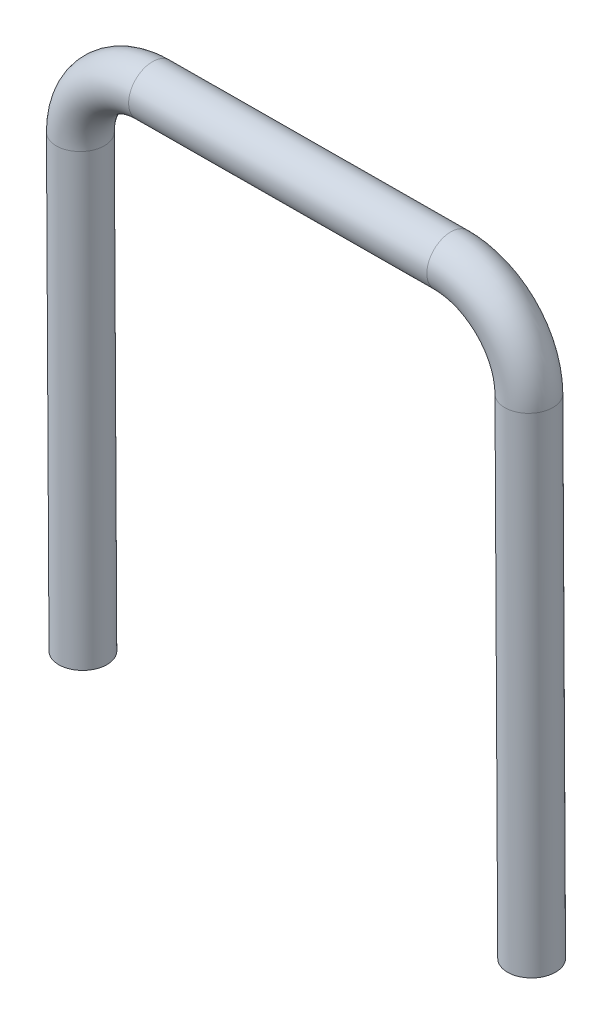
ISO-10303-21;
HEADER;
FILE_DESCRIPTION(('STEP AP214'),'2;1');
FILE_NAME('part.step','',(''),(''),'','','');
FILE_SCHEMA(('AUTOMOTIVE_DESIGN { 1 0 10303 214 1 1 1 1 }'));
ENDSEC;
DATA;
#1=APPLICATION_CONTEXT('core data for automotive mechanical design processes');
#2=APPLICATION_PROTOCOL_DEFINITION('international standard','automotive_design',2000,#1);
#3=PRODUCT_CONTEXT('',#1,'mechanical');
#4=PRODUCT('Part','Part','',(#3));
#5=PRODUCT_RELATED_PRODUCT_CATEGORY('part','',(#4));
#6=PRODUCT_DEFINITION_FORMATION('','',#4);
#7=PRODUCT_DEFINITION_CONTEXT('part definition',#1,'design');
#8=PRODUCT_DEFINITION('design','',#6,#7);
#9=PRODUCT_DEFINITION_SHAPE('','',#8);
#10=(LENGTH_UNIT() NAMED_UNIT(*) SI_UNIT(.MILLI.,.METRE.));
#11=(NAMED_UNIT(*) PLANE_ANGLE_UNIT() SI_UNIT($,.RADIAN.));
#12=(NAMED_UNIT(*) SI_UNIT($,.STERADIAN.) SOLID_ANGLE_UNIT());
#13=UNCERTAINTY_MEASURE_WITH_UNIT(LENGTH_MEASURE(1.E-05),#10,'distance_accuracy_value','');
#14=(GEOMETRIC_REPRESENTATION_CONTEXT(3) GLOBAL_UNCERTAINTY_ASSIGNED_CONTEXT((#13)) GLOBAL_UNIT_ASSIGNED_CONTEXT((#10,
#11,#12)) REPRESENTATION_CONTEXT('',''));
#15=CARTESIAN_POINT('',(0.,0.,0.));
#16=DIRECTION('',(0.,0.,1.));
#17=DIRECTION('',(1.,0.,0.));
#18=AXIS2_PLACEMENT_3D('',#15,#16,#17);
#19=CARTESIAN_POINT('',(-46.420753356991,4.59161939468769,-1.76544371842712E-13));
#20=DIRECTION('',(-0.00563734568943531,0.999984110040543,0.));
#21=DIRECTION('',(0.,0.,-1.));
#22=AXIS2_PLACEMENT_3D('',#19,#20,#21);
#23=CYLINDRICAL_SURFACE('',#22,2.5);
#24=CARTESIAN_POINT('',(-46.6839243014587,51.2743628683252,0.));
#25=DIRECTION('',(-0.00563734568943116,0.999984110040544,0.));
#26=DIRECTION('',(0.,0.,-1.));
#27=AXIS2_PLACEMENT_3D('',#24,#25,#26);
#28=CIRCLE('',#27,2.5);
#29=CARTESIAN_POINT('',(-46.6839243014588,51.2743628683252,-2.50000000000001));
#30=VERTEX_POINT('',#29);
#31=EDGE_CURVE('E12',#30,#30,#28,.T.);
#32=ORIENTED_EDGE('',*,*,#31,.F.);
#33=EDGE_LOOP('',(#32));
#34=FACE_BOUND('',#33,.T.);
#35=CARTESIAN_POINT('',(-46.420753356991,4.59161939468769,-1.76544371842712E-13));
#36=DIRECTION('',(0.00563734568943531,-0.999984110040544,0.));
#37=DIRECTION('',(0.,0.,1.));
#38=AXIS2_PLACEMENT_3D('',#35,#36,#37);
#39=CIRCLE('',#38,2.5);
#40=CARTESIAN_POINT('',(-46.420753356991,4.59161939468768,2.49999999999982));
#41=VERTEX_POINT('',#40);
#42=EDGE_CURVE('E137',#41,#41,#39,.T.);
#43=ORIENTED_EDGE('',*,*,#42,.F.);
#44=EDGE_LOOP('',(#43));
#45=FACE_BOUND('',#44,.T.);
#46=ADVANCED_FACE('F105',(#34,#45),#23,.T.);
#47=CARTESIAN_POINT('',(-8.04265016746616,50.9751657825808,0.));
#48=DIRECTION('',(0.,0.,1.));
#49=DIRECTION('',(0.999984110040544,0.00563734568942783,0.));
#50=AXIS2_PLACEMENT_3D('',#47,#48,#49);
#51=TOROIDAL_SURFACE('',#50,8.08507110906829,2.5);
#52=CARTESIAN_POINT('',(-8.08822850823162,59.0601084201969,0.));
#53=DIRECTION('',(-0.999984110040544,-0.00563734568943199,0.));
#54=DIRECTION('',(0.,0.,1.));
#55=AXIS2_PLACEMENT_3D('',#52,#53,#54);
#56=CIRCLE('',#55,2.5);
#57=CARTESIAN_POINT('',(-8.08822850823162,59.0601084201969,2.5));
#58=VERTEX_POINT('',#57);
#59=EDGE_CURVE('E120',#58,#58,#56,.T.);
#60=ORIENTED_EDGE('',*,*,#59,.F.);
#61=EDGE_LOOP('',(#60));
#62=FACE_BOUND('',#61,.T.);
#63=CARTESIAN_POINT('',(0.0422924701500044,51.0207441233462,0.));
#64=DIRECTION('',(-0.00563734568942783,0.999984110040544,0.));
#65=DIRECTION('',(0.,0.,1.));
#66=AXIS2_PLACEMENT_3D('',#63,#64,#65);
#67=CIRCLE('',#66,2.5);
#68=CARTESIAN_POINT('',(0.0422924701500042,51.0207441233462,-2.5));
#69=VERTEX_POINT('',#68);
#70=EDGE_CURVE('E133',#69,#69,#67,.T.);
#71=ORIENTED_EDGE('',*,*,#70,.T.);
#72=EDGE_LOOP('',(#71));
#73=FACE_BOUND('',#72,.T.);
#74=ADVANCED_FACE('F151',(#62,#73),#51,.T.);
#75=CARTESIAN_POINT('',(-0.530461851895863,152.619129703465,0.));
#76=DIRECTION('',(0.00563734568942783,-0.999984110040543,0.));
#77=DIRECTION('',(0.,0.,-1.));
#78=AXIS2_PLACEMENT_3D('',#75,#76,#77);
#79=CYLINDRICAL_SURFACE('',#78,2.5);
#80=CARTESIAN_POINT('',(0.328669631172938,0.221551333286567,0.));
#81=DIRECTION('',(-0.00563734568942783,0.999984110040544,0.));
#82=DIRECTION('',(0.,0.,1.));
#83=AXIS2_PLACEMENT_3D('',#80,#81,#82);
#84=CIRCLE('',#83,2.5);
#85=CARTESIAN_POINT('',(0.328669631172938,0.221551333286552,-2.5));
#86=VERTEX_POINT('',#85);
#87=EDGE_CURVE('E130',#86,#86,#84,.T.);
#88=CARTESIAN_POINT('',(0.328669631172938,0.221551333286552,-2.5));
#89=CARTESIAN_POINT('',(0.325686535745616,0.750709591516342,-2.5));
#90=CARTESIAN_POINT('',(0.322703440318294,1.27986784974613,-2.5));
#91=CARTESIAN_POINT('',(0.316737249463649,2.33818436620572,-2.5));
#92=CARTESIAN_POINT('',(0.313754154036327,2.86734262443551,-2.5));
#93=CARTESIAN_POINT('',(0.307787963181683,3.92565914089508,-2.5));
#94=CARTESIAN_POINT('',(0.30480486775436,4.45481739912486,-2.5));
#95=CARTESIAN_POINT('',(0.298838676899716,5.51313391558444,-2.5));
#96=CARTESIAN_POINT('',(0.295855581472394,6.04229217381423,-2.5));
#97=CARTESIAN_POINT('',(0.289889390617749,7.10060869027381,-2.5));
#98=CARTESIAN_POINT('',(0.286906295190427,7.6297669485036,-2.5));
#99=CARTESIAN_POINT('',(0.280940104335783,8.68808346496317,-2.5));
#100=CARTESIAN_POINT('',(0.27795700890846,9.21724172319296,-2.5));
#101=CARTESIAN_POINT('',(0.271990818053816,10.2755582396525,-2.5));
#102=CARTESIAN_POINT('',(0.269007722626494,10.8047164978823,-2.5));
#103=CARTESIAN_POINT('',(0.263041531771849,11.8630330143419,-2.5));
#104=CARTESIAN_POINT('',(0.260058436344527,12.3921912725717,-2.5));
#105=CARTESIAN_POINT('',(0.254092245489882,13.4505077890313,-2.5));
#106=CARTESIAN_POINT('',(0.25110915006256,13.979666047261,-2.5));
#107=CARTESIAN_POINT('',(0.245142959207916,15.0379825637206,-2.5));
#108=CARTESIAN_POINT('',(0.242159863780594,15.5671408219504,-2.5));
#109=CARTESIAN_POINT('',(0.236193672925949,16.62545733841,-2.5));
#110=CARTESIAN_POINT('',(0.233210577498627,17.1546155966398,-2.5));
#111=CARTESIAN_POINT('',(0.227244386643982,18.2129321130994,-2.5));
#112=CARTESIAN_POINT('',(0.22426129121666,18.7420903713291,-2.5));
#113=CARTESIAN_POINT('',(0.218295100362016,19.8004068877887,-2.5));
#114=CARTESIAN_POINT('',(0.215312004934693,20.3295651460185,-2.5));
#115=CARTESIAN_POINT('',(0.209345814080049,21.3878816624781,-2.5));
#116=CARTESIAN_POINT('',(0.206362718652727,21.9170399207079,-2.5));
#117=CARTESIAN_POINT('',(0.200396527798082,22.9753564371675,-2.5));
#118=CARTESIAN_POINT('',(0.19741343237076,23.5045146953972,-2.5));
#119=CARTESIAN_POINT('',(0.191447241516116,24.5628312118568,-2.5));
#120=CARTESIAN_POINT('',(0.188464146088793,25.0919894700866,-2.5));
#121=CARTESIAN_POINT('',(0.182497955234149,26.1503059865462,-2.5));
#122=CARTESIAN_POINT('',(0.179514859806827,26.679464244776,-2.5));
#123=CARTESIAN_POINT('',(0.173548668952182,27.7377807612355,-2.5));
#124=CARTESIAN_POINT('',(0.17056557352486,28.2669390194653,-2.5));
#125=CARTESIAN_POINT('',(0.164599382670216,29.3252555359249,-2.5));
#126=CARTESIAN_POINT('',(0.161616287242893,29.8544137941547,-2.5));
#127=CARTESIAN_POINT('',(0.155650096388249,30.9127303106143,-2.5));
#128=CARTESIAN_POINT('',(0.152667000960927,31.441888568844,-2.5));
#129=CARTESIAN_POINT('',(0.146700810106282,32.5002050853036,-2.5));
#130=CARTESIAN_POINT('',(0.14371771467896,33.0293633435334,-2.5));
#131=CARTESIAN_POINT('',(0.137751523824316,34.087679859993,-2.5));
#132=CARTESIAN_POINT('',(0.134768428396993,34.6168381182228,-2.5));
#133=CARTESIAN_POINT('',(0.128802237542349,35.6751546346824,-2.5));
#134=CARTESIAN_POINT('',(0.125819142115027,36.2043128929121,-2.5));
#135=CARTESIAN_POINT('',(0.119852951260382,37.2626294093717,-2.5));
#136=CARTESIAN_POINT('',(0.11686985583306,37.7917876676015,-2.5));
#137=CARTESIAN_POINT('',(0.110903664978415,38.8501041840611,-2.5));
#138=CARTESIAN_POINT('',(0.107920569551093,39.3792624422909,-2.5));
#139=CARTESIAN_POINT('',(0.101954378696449,40.4375789587504,-2.5));
#140=CARTESIAN_POINT('',(0.0989712832691266,40.9667372169802,-2.5));
#141=CARTESIAN_POINT('',(0.0930050924144822,42.0250537334398,-2.5));
#142=CARTESIAN_POINT('',(0.09002199698716,42.5542119916696,-2.5));
#143=CARTESIAN_POINT('',(0.0840558061325155,43.6125285081292,-2.5));
#144=CARTESIAN_POINT('',(0.0810727107051932,44.141686766359,-2.5));
#145=CARTESIAN_POINT('',(0.0751065198505488,45.2000032828185,-2.5));
#146=CARTESIAN_POINT('',(0.0721234244232265,45.7291615410483,-2.5));
#147=CARTESIAN_POINT('',(0.0661572335685821,46.7874780575079,-2.5));
#148=CARTESIAN_POINT('',(0.0631741381412599,47.3166363157377,-2.5));
#149=CARTESIAN_POINT('',(0.0572079472866154,48.3749528321973,-2.5));
#150=CARTESIAN_POINT('',(0.0542248518592931,48.9041110904271,-2.5));
#151=CARTESIAN_POINT('',(0.0482586610046486,49.9624276068866,-2.5));
#152=CARTESIAN_POINT('',(0.0452755655773264,50.4915858651164,-2.5));
#153=CARTESIAN_POINT('',(0.0422924701500042,51.0207441233462,-2.5));
#154=B_SPLINE_CURVE_WITH_KNOTS('',3,(#88,#89,#90,#91,#92,#93,#94,#95,#96,#97,#98,#99,#100,#101,
#102,#103,#104,#105,#106,#107,#108,#109,#110,#111,#112,#113,#114,#115,#116,#117,#118,#119,#120,
#121,#122,#123,#124,#125,#126,#127,#128,#129,#130,#131,#132,#133,#134,#135,#136,#137,#138,#139,
#140,#141,#142,#143,#144,#145,#146,#147,#148,#149,#150,#151,#152,#153),.UNSPECIFIED.,.F.,.F.,(4,
2,2,2,2,2,2,2,2,2,2,2,2,2,2,2,2,2,2,2,2,2,2,2,2,2,2,2,2,2,2,2,4),(0.,1.58750000000001,
3.17500000000002,4.7625,6.35000000000002,7.93750000000003,9.52500000000001,11.1125,12.7,14.2875,
15.875,17.4625,19.05,20.6375,22.225,23.8125,25.4,26.9875000000001,28.575,30.1625,31.75,33.3375,
34.925,36.5125000000001,38.1000000000001,39.6875000000001,41.2750000000001,42.8625000000001,
44.4500000000001,46.0375000000001,47.6250000000001,49.2125000000001,50.8000000000001),.UNSPECIFIED.);
#155=EDGE_CURVE('BSEAM157',#86,#69,#154,.T.);
#156=ORIENTED_EDGE('',*,*,#87,.T.);
#157=ORIENTED_EDGE('',*,*,#70,.F.);
#158=ORIENTED_EDGE('',*,*,#155,.T.);
#159=ORIENTED_EDGE('',*,*,#155,.F.);
#160=EDGE_LOOP('',(#156,#158,#157,#159));
#161=FACE_BOUND('',#160,.T.);
#162=ADVANCED_FACE('F157',(#161),#79,.T.);
#163=CARTESIAN_POINT('',(-39.116,51.3170265516882,-2.02048781873498E-13));
#164=DIRECTION('',(0.,0.,-1.));
#165=DIRECTION('',(0.,1.,0.));
#166=AXIS2_PLACEMENT_3D('',#163,#164,#165);
#167=TOROIDAL_SURFACE('',#166,7.56804455737974,2.5);
#168=CARTESIAN_POINT('',(-39.1586636833629,58.884950853147,0.));
#169=DIRECTION('',(0.999984110040544,0.00563734568942783,0.));
#170=DIRECTION('',(0.,0.,-1.));
#171=AXIS2_PLACEMENT_3D('',#168,#169,#170);
#172=CIRCLE('',#171,2.5);
#173=CARTESIAN_POINT('',(-39.1586636833629,58.884950853147,-2.5));
#174=VERTEX_POINT('',#173);
#175=EDGE_CURVE('E114',#174,#174,#172,.T.);
#176=ORIENTED_EDGE('',*,*,#175,.F.);
#177=EDGE_LOOP('',(#176));
#178=FACE_BOUND('',#177,.T.);
#179=ORIENTED_EDGE('',*,*,#31,.T.);
#180=EDGE_LOOP('',(#179));
#181=FACE_BOUND('',#180,.T.);
#182=ADVANCED_FACE('F163',(#178,#181),#167,.T.);
#183=CARTESIAN_POINT('',(-96.9868158908359,58.5589483884064,0.));
#184=DIRECTION('',(0.999984110040543,0.00563734568943199,0.));
#185=DIRECTION('',(0.,0.,-1.));
#186=AXIS2_PLACEMENT_3D('',#183,#184,#185);
#187=CYLINDRICAL_SURFACE('',#186,2.5);
#188=ORIENTED_EDGE('',*,*,#59,.T.);
#189=EDGE_LOOP('',(#188));
#190=FACE_BOUND('',#189,.T.);
#191=ORIENTED_EDGE('',*,*,#175,.T.);
#192=EDGE_LOOP('',(#191));
#193=FACE_BOUND('',#192,.T.);
#194=ADVANCED_FACE('F167',(#190,#193),#187,.T.);
#195=CARTESIAN_POINT('',(-46.420753356991,4.59161939468769,-1.76544371842712E-13));
#196=DIRECTION('',(0.00563734568943531,-0.999984110040544,0.));
#197=DIRECTION('',(0.,0.,1.));
#198=AXIS2_PLACEMENT_3D('',#195,#196,#197);
#199=PLANE('',#198);
#200=ORIENTED_EDGE('',*,*,#42,.T.);
#201=EDGE_LOOP('',(#200));
#202=FACE_BOUND('',#201,.T.);
#203=ADVANCED_FACE('F148',(#202),#199,.T.);
#204=CARTESIAN_POINT('',(0.328669631172938,0.221551333286567,0.));
#205=DIRECTION('',(-0.00563734568942783,0.999984110040544,0.));
#206=DIRECTION('',(0.,0.,1.));
#207=AXIS2_PLACEMENT_3D('',#204,#205,#206);
#208=PLANE('',#207);
#209=ORIENTED_EDGE('',*,*,#87,.F.);
#210=EDGE_LOOP('',(#209));
#211=FACE_BOUND('',#210,.T.);
#212=ADVANCED_FACE('F107',(#211),#208,.F.);
#213=CLOSED_SHELL('',(#46,#74,#162,#182,#194,#203,#212));
#214=MANIFOLD_SOLID_BREP('B2',#213);
#215=ADVANCED_BREP_SHAPE_REPRESENTATION('',(#18,#214),#14);
#216=SHAPE_DEFINITION_REPRESENTATION(#9,#215);
ENDSEC;
END-ISO-10303-21;
